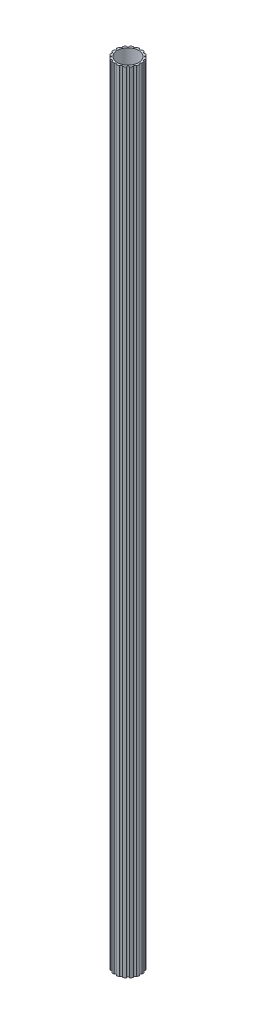
ISO-10303-21;
HEADER;
FILE_DESCRIPTION(('STEP AP214'),'2;1');
FILE_NAME('part.step','',(''),(''),'','','');
FILE_SCHEMA(('AUTOMOTIVE_DESIGN { 1 0 10303 214 1 1 1 1 }'));
ENDSEC;
DATA;
#1=APPLICATION_CONTEXT('core data for automotive mechanical design processes');
#2=APPLICATION_PROTOCOL_DEFINITION('international standard','automotive_design',2000,#1);
#3=PRODUCT_CONTEXT('',#1,'mechanical');
#4=PRODUCT('Part','Part','',(#3));
#5=PRODUCT_RELATED_PRODUCT_CATEGORY('part','',(#4));
#6=PRODUCT_DEFINITION_FORMATION('','',#4);
#7=PRODUCT_DEFINITION_CONTEXT('part definition',#1,'design');
#8=PRODUCT_DEFINITION('design','',#6,#7);
#9=PRODUCT_DEFINITION_SHAPE('','',#8);
#10=(LENGTH_UNIT() NAMED_UNIT(*) SI_UNIT(.MILLI.,.METRE.));
#11=(NAMED_UNIT(*) PLANE_ANGLE_UNIT() SI_UNIT($,.RADIAN.));
#12=(NAMED_UNIT(*) SI_UNIT($,.STERADIAN.) SOLID_ANGLE_UNIT());
#13=UNCERTAINTY_MEASURE_WITH_UNIT(LENGTH_MEASURE(1.E-05),#10,'distance_accuracy_value','');
#14=(GEOMETRIC_REPRESENTATION_CONTEXT(3) GLOBAL_UNCERTAINTY_ASSIGNED_CONTEXT((#13)) GLOBAL_UNIT_ASSIGNED_CONTEXT((#10,
#11,#12)) REPRESENTATION_CONTEXT('',''));
#15=CARTESIAN_POINT('',(0.,0.,0.));
#16=DIRECTION('',(0.,0.,1.));
#17=DIRECTION('',(1.,0.,0.));
#18=AXIS2_PLACEMENT_3D('',#15,#16,#17);
#19=CARTESIAN_POINT('',(0.,1070.,0.));
#20=DIRECTION('',(0.,-1.,0.));
#21=DIRECTION('',(0.,0.,-1.));
#22=AXIS2_PLACEMENT_3D('',#19,#20,#21);
#23=CYLINDRICAL_SURFACE('',#22,17.4625);
#24=DIRECTION('',(0.,-1.,0.));
#25=VECTOR('',#24,1.);
#26=CARTESIAN_POINT('',(11.2426162287253,0.,13.3619791417141));
#27=LINE('',#26,#25);
#28=CARTESIAN_POINT('',(11.2426162287253,1070.,13.3619791417141));
#29=VERTEX_POINT('',#28);
#30=CARTESIAN_POINT('',(11.2426162287253,0.,13.3619791417141));
#31=VERTEX_POINT('',#30);
#32=EDGE_CURVE('E62',#29,#31,#27,.T.);
#33=ORIENTED_EDGE('',*,*,#32,.F.);
#34=CARTESIAN_POINT('',(0.,1070.,0.));
#35=DIRECTION('',(0.,1.,0.));
#36=DIRECTION('',(0.,0.,1.));
#37=AXIS2_PLACEMENT_3D('',#34,#35,#36);
#38=CIRCLE('',#37,17.4625);
#39=CARTESIAN_POINT('',(8.04249607570028,1070.,15.5002310667404));
#40=VERTEX_POINT('',#39);
#41=EDGE_CURVE('E304',#40,#29,#38,.T.);
#42=ORIENTED_EDGE('',*,*,#41,.F.);
#43=DIRECTION('',(0.,-1.,0.));
#44=VECTOR('',#43,1.);
#45=CARTESIAN_POINT('',(8.04249607570028,0.,15.5002310667404));
#46=LINE('',#45,#44);
#47=CARTESIAN_POINT('',(8.04249607570028,0.,15.5002310667404));
#48=VERTEX_POINT('',#47);
#49=EDGE_CURVE('E402',#48,#40,#46,.F.);
#50=ORIENTED_EDGE('',*,*,#49,.F.);
#51=CARTESIAN_POINT('',(0.,0.,0.));
#52=DIRECTION('',(0.,1.,0.));
#53=DIRECTION('',(0.,0.,1.));
#54=AXIS2_PLACEMENT_3D('',#51,#52,#53);
#55=CIRCLE('',#54,17.4625);
#56=EDGE_CURVE('E508',#48,#31,#55,.T.);
#57=ORIENTED_EDGE('',*,*,#56,.T.);
#58=EDGE_LOOP('',(#33,#42,#50,#57));
#59=FACE_BOUND('',#58,.T.);
#60=ADVANCED_FACE('F41',(#59),#23,.T.);
#61=DIRECTION('',(0.,-1.,0.));
#62=VECTOR('',#61,1.);
#63=CARTESIAN_POINT('',(13.3619791417141,0.,11.2426162287253));
#64=LINE('',#63,#62);
#65=CARTESIAN_POINT('',(13.3619791417141,0.,11.2426162287253));
#66=VERTEX_POINT('',#65);
#67=CARTESIAN_POINT('',(13.3619791417141,1070.,11.2426162287253));
#68=VERTEX_POINT('',#67);
#69=EDGE_CURVE('E395',#66,#68,#64,.F.);
#70=ORIENTED_EDGE('',*,*,#69,.F.);
#71=CARTESIAN_POINT('',(15.5002310667404,0.,8.04249607570027));
#72=VERTEX_POINT('',#71);
#73=EDGE_CURVE('E504',#66,#72,#55,.T.);
#74=ORIENTED_EDGE('',*,*,#73,.T.);
#75=DIRECTION('',(0.,-1.,0.));
#76=VECTOR('',#75,1.);
#77=CARTESIAN_POINT('',(15.5002310667404,0.,8.04249607570028));
#78=LINE('',#77,#76);
#79=CARTESIAN_POINT('',(15.5002310667404,1070.,8.04249607570028));
#80=VERTEX_POINT('',#79);
#81=EDGE_CURVE('E54',#80,#72,#78,.T.);
#82=ORIENTED_EDGE('',*,*,#81,.F.);
#83=EDGE_CURVE('E299',#68,#80,#38,.T.);
#84=ORIENTED_EDGE('',*,*,#83,.F.);
#85=EDGE_LOOP('',(#70,#74,#82,#84));
#86=FACE_BOUND('',#85,.T.);
#87=ADVANCED_FACE('F477',(#86),#23,.T.);
#88=DIRECTION('',(0.,-1.,0.));
#89=VECTOR('',#88,1.);
#90=CARTESIAN_POINT('',(5.2734149844567,0.,16.6472220100444));
#91=LINE('',#90,#89);
#92=CARTESIAN_POINT('',(5.2734149844567,1070.,16.6472220100444));
#93=VERTEX_POINT('',#92);
#94=CARTESIAN_POINT('',(5.27341498445671,0.,16.6472220100444));
#95=VERTEX_POINT('',#94);
#96=EDGE_CURVE('E398',#93,#95,#91,.T.);
#97=ORIENTED_EDGE('',*,*,#96,.F.);
#98=CARTESIAN_POINT('',(1.4986158875696,1070.,17.3980762347888));
#99=VERTEX_POINT('',#98);
#100=EDGE_CURVE('E306',#99,#93,#38,.T.);
#101=ORIENTED_EDGE('',*,*,#100,.F.);
#102=DIRECTION('',(0.,-1.,0.));
#103=VECTOR('',#102,1.);
#104=CARTESIAN_POINT('',(1.4986158875696,0.,17.3980762347888));
#105=LINE('',#104,#103);
#106=CARTESIAN_POINT('',(1.4986158875696,0.,17.3980762347888));
#107=VERTEX_POINT('',#106);
#108=EDGE_CURVE('E408',#107,#99,#105,.F.);
#109=ORIENTED_EDGE('',*,*,#108,.F.);
#110=EDGE_CURVE('E509',#107,#95,#55,.T.);
#111=ORIENTED_EDGE('',*,*,#110,.T.);
#112=EDGE_LOOP('',(#97,#101,#109,#111));
#113=FACE_BOUND('',#112,.T.);
#114=ADVANCED_FACE('F486',(#113),#23,.T.);
#115=DIRECTION('',(0.,-1.,0.));
#116=VECTOR('',#115,1.);
#117=CARTESIAN_POINT('',(-1.4986158875696,0.,17.3980762347888));
#118=LINE('',#117,#116);
#119=CARTESIAN_POINT('',(-1.4986158875696,1070.,17.3980762347888));
#120=VERTEX_POINT('',#119);
#121=CARTESIAN_POINT('',(-1.49861588756959,0.,17.3980762347888));
#122=VERTEX_POINT('',#121);
#123=EDGE_CURVE('E404',#120,#122,#118,.T.);
#124=ORIENTED_EDGE('',*,*,#123,.F.);
#125=CARTESIAN_POINT('',(-5.2734149844567,1070.,16.6472220100444));
#126=VERTEX_POINT('',#125);
#127=EDGE_CURVE('E315',#126,#120,#38,.T.);
#128=ORIENTED_EDGE('',*,*,#127,.F.);
#129=DIRECTION('',(0.,-1.,0.));
#130=VECTOR('',#129,1.);
#131=CARTESIAN_POINT('',(-5.2734149844567,0.,16.6472220100444));
#132=LINE('',#131,#130);
#133=CARTESIAN_POINT('',(-5.2734149844567,0.,16.6472220100444));
#134=VERTEX_POINT('',#133);
#135=EDGE_CURVE('E417',#134,#126,#132,.F.);
#136=ORIENTED_EDGE('',*,*,#135,.F.);
#137=EDGE_CURVE('E511',#134,#122,#55,.T.);
#138=ORIENTED_EDGE('',*,*,#137,.T.);
#139=EDGE_LOOP('',(#124,#128,#136,#138));
#140=FACE_BOUND('',#139,.T.);
#141=ADVANCED_FACE('F554',(#140),#23,.T.);
#142=DIRECTION('',(0.,-1.,0.));
#143=VECTOR('',#142,1.);
#144=CARTESIAN_POINT('',(-8.04249607570028,0.,15.5002310667404));
#145=LINE('',#144,#143);
#146=CARTESIAN_POINT('',(-8.04249607570028,1070.,15.5002310667404));
#147=VERTEX_POINT('',#146);
#148=CARTESIAN_POINT('',(-8.04249607570027,0.,15.5002310667404));
#149=VERTEX_POINT('',#148);
#150=EDGE_CURVE('E415',#147,#149,#145,.T.);
#151=ORIENTED_EDGE('',*,*,#150,.F.);
#152=CARTESIAN_POINT('',(-11.2426162287253,1070.,13.3619791417141));
#153=VERTEX_POINT('',#152);
#154=EDGE_CURVE('E316',#153,#147,#38,.T.);
#155=ORIENTED_EDGE('',*,*,#154,.F.);
#156=DIRECTION('',(0.,-1.,0.));
#157=VECTOR('',#156,1.);
#158=CARTESIAN_POINT('',(-11.2426162287253,0.,13.3619791417141));
#159=LINE('',#158,#157);
#160=CARTESIAN_POINT('',(-11.2426162287253,0.,13.3619791417141));
#161=VERTEX_POINT('',#160);
#162=EDGE_CURVE('E422',#161,#153,#159,.F.);
#163=ORIENTED_EDGE('',*,*,#162,.F.);
#164=EDGE_CURVE('E518',#161,#149,#55,.T.);
#165=ORIENTED_EDGE('',*,*,#164,.T.);
#166=EDGE_LOOP('',(#151,#155,#163,#165));
#167=FACE_BOUND('',#166,.T.);
#168=ADVANCED_FACE('F561',(#167),#23,.T.);
#169=DIRECTION('',(0.,-1.,0.));
#170=VECTOR('',#169,1.);
#171=CARTESIAN_POINT('',(-13.3619791417141,0.,11.2426162287253));
#172=LINE('',#171,#170);
#173=CARTESIAN_POINT('',(-13.3619791417141,1070.,11.2426162287253));
#174=VERTEX_POINT('',#173);
#175=CARTESIAN_POINT('',(-13.3619791417141,0.,11.2426162287253));
#176=VERTEX_POINT('',#175);
#177=EDGE_CURVE('E419',#174,#176,#172,.T.);
#178=ORIENTED_EDGE('',*,*,#177,.F.);
#179=CARTESIAN_POINT('',(-15.5002310667404,1070.,8.04249607570028));
#180=VERTEX_POINT('',#179);
#181=EDGE_CURVE('E319',#180,#174,#38,.T.);
#182=ORIENTED_EDGE('',*,*,#181,.F.);
#183=DIRECTION('',(0.,-1.,0.));
#184=VECTOR('',#183,1.);
#185=CARTESIAN_POINT('',(-15.5002310667404,0.,8.04249607570028));
#186=LINE('',#185,#184);
#187=CARTESIAN_POINT('',(-15.5002310667404,0.,8.04249607570028));
#188=VERTEX_POINT('',#187);
#189=EDGE_CURVE('E433',#188,#180,#186,.F.);
#190=ORIENTED_EDGE('',*,*,#189,.F.);
#191=EDGE_CURVE('E522',#188,#176,#55,.T.);
#192=ORIENTED_EDGE('',*,*,#191,.T.);
#193=EDGE_LOOP('',(#178,#182,#190,#192));
#194=FACE_BOUND('',#193,.T.);
#195=ADVANCED_FACE('F546',(#194),#23,.T.);
#196=DIRECTION('',(0.,-1.,0.));
#197=VECTOR('',#196,1.);
#198=CARTESIAN_POINT('',(-16.6472220100444,0.,5.2734149844567));
#199=LINE('',#198,#197);
#200=CARTESIAN_POINT('',(-16.6472220100444,1070.,5.2734149844567));
#201=VERTEX_POINT('',#200);
#202=CARTESIAN_POINT('',(-16.6472220100444,0.,5.27341498445671));
#203=VERTEX_POINT('',#202);
#204=EDGE_CURVE('E428',#201,#203,#199,.T.);
#205=ORIENTED_EDGE('',*,*,#204,.F.);
#206=CARTESIAN_POINT('',(-17.3980762347888,1070.,1.4986158875696));
#207=VERTEX_POINT('',#206);
#208=EDGE_CURVE('E322',#207,#201,#38,.T.);
#209=ORIENTED_EDGE('',*,*,#208,.F.);
#210=DIRECTION('',(0.,-1.,0.));
#211=VECTOR('',#210,1.);
#212=CARTESIAN_POINT('',(-17.3980762347888,0.,1.4986158875696));
#213=LINE('',#212,#211);
#214=CARTESIAN_POINT('',(-17.3980762347888,0.,1.4986158875696));
#215=VERTEX_POINT('',#214);
#216=EDGE_CURVE('E442',#215,#207,#213,.F.);
#217=ORIENTED_EDGE('',*,*,#216,.F.);
#218=EDGE_CURVE('E278',#215,#203,#55,.T.);
#219=ORIENTED_EDGE('',*,*,#218,.T.);
#220=EDGE_LOOP('',(#205,#209,#217,#219));
#221=FACE_BOUND('',#220,.T.);
#222=ADVANCED_FACE('F539',(#221),#23,.T.);
#223=DIRECTION('',(0.,-1.,0.));
#224=VECTOR('',#223,1.);
#225=CARTESIAN_POINT('',(-17.3980762347888,0.,-1.4986158875696));
#226=LINE('',#225,#224);
#227=CARTESIAN_POINT('',(-17.3980762347888,1070.,-1.4986158875696));
#228=VERTEX_POINT('',#227);
#229=CARTESIAN_POINT('',(-17.3980762347888,0.,-1.49861588756959));
#230=VERTEX_POINT('',#229);
#231=EDGE_CURVE('E436',#228,#230,#226,.T.);
#232=ORIENTED_EDGE('',*,*,#231,.F.);
#233=CARTESIAN_POINT('',(-16.6472220100444,1070.,-5.2734149844567));
#234=VERTEX_POINT('',#233);
#235=EDGE_CURVE('E327',#234,#228,#38,.T.);
#236=ORIENTED_EDGE('',*,*,#235,.F.);
#237=DIRECTION('',(0.,-1.,0.));
#238=VECTOR('',#237,1.);
#239=CARTESIAN_POINT('',(-16.6472220100444,0.,-5.2734149844567));
#240=LINE('',#239,#238);
#241=CARTESIAN_POINT('',(-16.6472220100444,0.,-5.2734149844567));
#242=VERTEX_POINT('',#241);
#243=EDGE_CURVE('E450',#242,#234,#240,.F.);
#244=ORIENTED_EDGE('',*,*,#243,.F.);
#245=EDGE_CURVE('E277',#242,#230,#55,.T.);
#246=ORIENTED_EDGE('',*,*,#245,.T.);
#247=EDGE_LOOP('',(#232,#236,#244,#246));
#248=FACE_BOUND('',#247,.T.);
#249=ADVANCED_FACE('F572',(#248),#23,.T.);
#250=DIRECTION('',(0.,-1.,0.));
#251=VECTOR('',#250,1.);
#252=CARTESIAN_POINT('',(-15.5002310667404,0.,-8.04249607570028));
#253=LINE('',#252,#251);
#254=CARTESIAN_POINT('',(-15.5002310667404,1070.,-8.04249607570028));
#255=VERTEX_POINT('',#254);
#256=CARTESIAN_POINT('',(-15.5002310667404,0.,-8.04249607570027));
#257=VERTEX_POINT('',#256);
#258=EDGE_CURVE('E441',#255,#257,#253,.T.);
#259=ORIENTED_EDGE('',*,*,#258,.F.);
#260=CARTESIAN_POINT('',(-13.3619791417141,1070.,-11.2426162287253));
#261=VERTEX_POINT('',#260);
#262=EDGE_CURVE('E270',#261,#255,#38,.T.);
#263=ORIENTED_EDGE('',*,*,#262,.F.);
#264=DIRECTION('',(0.,-1.,0.));
#265=VECTOR('',#264,1.);
#266=CARTESIAN_POINT('',(-13.3619791417141,0.,-11.2426162287253));
#267=LINE('',#266,#265);
#268=CARTESIAN_POINT('',(-13.3619791417141,0.,-11.2426162287253));
#269=VERTEX_POINT('',#268);
#270=EDGE_CURVE('E253',#269,#261,#267,.F.);
#271=ORIENTED_EDGE('',*,*,#270,.F.);
#272=EDGE_CURVE('E264',#269,#257,#55,.T.);
#273=ORIENTED_EDGE('',*,*,#272,.T.);
#274=EDGE_LOOP('',(#259,#263,#271,#273));
#275=FACE_BOUND('',#274,.T.);
#276=ADVANCED_FACE('F262',(#275),#23,.T.);
#277=DIRECTION('',(0.,-1.,0.));
#278=VECTOR('',#277,1.);
#279=CARTESIAN_POINT('',(-11.2426162287253,0.,-13.3619791417141));
#280=LINE('',#279,#278);
#281=CARTESIAN_POINT('',(-11.2426162287253,1070.,-13.3619791417141));
#282=VERTEX_POINT('',#281);
#283=CARTESIAN_POINT('',(-11.2426162287253,0.,-13.3619791417141));
#284=VERTEX_POINT('',#283);
#285=EDGE_CURVE('E255',#282,#284,#280,.T.);
#286=ORIENTED_EDGE('',*,*,#285,.F.);
#287=CARTESIAN_POINT('',(-8.04249607570029,1070.,-15.5002310667404));
#288=VERTEX_POINT('',#287);
#289=EDGE_CURVE('E331',#288,#282,#38,.T.);
#290=ORIENTED_EDGE('',*,*,#289,.F.);
#291=DIRECTION('',(0.,-1.,0.));
#292=VECTOR('',#291,1.);
#293=CARTESIAN_POINT('',(-8.04249607570029,0.,-15.5002310667404));
#294=LINE('',#293,#292);
#295=CARTESIAN_POINT('',(-8.04249607570029,0.,-15.5002310667404));
#296=VERTEX_POINT('',#295);
#297=EDGE_CURVE('E850',#296,#288,#294,.F.);
#298=ORIENTED_EDGE('',*,*,#297,.F.);
#299=EDGE_CURVE('E274',#296,#284,#55,.T.);
#300=ORIENTED_EDGE('',*,*,#299,.T.);
#301=EDGE_LOOP('',(#286,#290,#298,#300));
#302=FACE_BOUND('',#301,.T.);
#303=ADVANCED_FACE('F583',(#302),#23,.T.);
#304=DIRECTION('',(0.,-1.,0.));
#305=VECTOR('',#304,1.);
#306=CARTESIAN_POINT('',(-5.27341498445671,0.,-16.6472220100444));
#307=LINE('',#306,#305);
#308=CARTESIAN_POINT('',(-5.27341498445671,1070.,-16.6472220100444));
#309=VERTEX_POINT('',#308);
#310=CARTESIAN_POINT('',(-5.27341498445672,0.,-16.6472220100444));
#311=VERTEX_POINT('',#310);
#312=EDGE_CURVE('E837',#309,#311,#307,.T.);
#313=ORIENTED_EDGE('',*,*,#312,.F.);
#314=CARTESIAN_POINT('',(-1.4986158875696,1070.,-17.3980762347888));
#315=VERTEX_POINT('',#314);
#316=EDGE_CURVE('E336',#315,#309,#38,.T.);
#317=ORIENTED_EDGE('',*,*,#316,.F.);
#318=DIRECTION('',(0.,-1.,0.));
#319=VECTOR('',#318,1.);
#320=CARTESIAN_POINT('',(-1.4986158875696,0.,-17.3980762347888));
#321=LINE('',#320,#319);
#322=CARTESIAN_POINT('',(-1.4986158875696,0.,-17.3980762347888));
#323=VERTEX_POINT('',#322);
#324=EDGE_CURVE('E842',#323,#315,#321,.F.);
#325=ORIENTED_EDGE('',*,*,#324,.F.);
#326=EDGE_CURVE('E279',#323,#311,#55,.T.);
#327=ORIENTED_EDGE('',*,*,#326,.T.);
#328=EDGE_LOOP('',(#313,#317,#325,#327));
#329=FACE_BOUND('',#328,.T.);
#330=ADVANCED_FACE('F760',(#329),#23,.T.);
#331=DIRECTION('',(0.,-1.,0.));
#332=VECTOR('',#331,1.);
#333=CARTESIAN_POINT('',(1.4986158875696,0.,-17.3980762347888));
#334=LINE('',#333,#332);
#335=CARTESIAN_POINT('',(1.4986158875696,1070.,-17.3980762347888));
#336=VERTEX_POINT('',#335);
#337=CARTESIAN_POINT('',(1.49861588756959,0.,-17.3980762347888));
#338=VERTEX_POINT('',#337);
#339=EDGE_CURVE('E372',#336,#338,#334,.T.);
#340=ORIENTED_EDGE('',*,*,#339,.F.);
#341=CARTESIAN_POINT('',(5.2734149844567,1070.,-16.6472220100444));
#342=VERTEX_POINT('',#341);
#343=EDGE_CURVE('E339',#342,#336,#38,.T.);
#344=ORIENTED_EDGE('',*,*,#343,.F.);
#345=DIRECTION('',(0.,-1.,0.));
#346=VECTOR('',#345,1.);
#347=CARTESIAN_POINT('',(5.27341498445671,0.,-16.6472220100444));
#348=LINE('',#347,#346);
#349=CARTESIAN_POINT('',(5.2734149844567,0.,-16.6472220100444));
#350=VERTEX_POINT('',#349);
#351=EDGE_CURVE('E364',#350,#342,#348,.F.);
#352=ORIENTED_EDGE('',*,*,#351,.F.);
#353=EDGE_CURVE('E831',#350,#338,#55,.T.);
#354=ORIENTED_EDGE('',*,*,#353,.T.);
#355=EDGE_LOOP('',(#340,#344,#352,#354));
#356=FACE_BOUND('',#355,.T.);
#357=ADVANCED_FACE('F766',(#356),#23,.T.);
#358=DIRECTION('',(0.,-1.,0.));
#359=VECTOR('',#358,1.);
#360=CARTESIAN_POINT('',(8.04249607570029,0.,-15.5002310667404));
#361=LINE('',#360,#359);
#362=CARTESIAN_POINT('',(8.04249607570029,1070.,-15.5002310667404));
#363=VERTEX_POINT('',#362);
#364=CARTESIAN_POINT('',(8.04249607570027,0.,-15.5002310667404));
#365=VERTEX_POINT('',#364);
#366=EDGE_CURVE('E359',#363,#365,#361,.T.);
#367=ORIENTED_EDGE('',*,*,#366,.F.);
#368=CARTESIAN_POINT('',(11.2426162287253,1070.,-13.3619791417141));
#369=VERTEX_POINT('',#368);
#370=EDGE_CURVE('E298',#369,#363,#38,.T.);
#371=ORIENTED_EDGE('',*,*,#370,.F.);
#372=DIRECTION('',(0.,-1.,0.));
#373=VECTOR('',#372,1.);
#374=CARTESIAN_POINT('',(11.2426162287253,0.,-13.3619791417141));
#375=LINE('',#374,#373);
#376=CARTESIAN_POINT('',(11.2426162287253,0.,-13.3619791417141));
#377=VERTEX_POINT('',#376);
#378=EDGE_CURVE('E360',#377,#369,#375,.F.);
#379=ORIENTED_EDGE('',*,*,#378,.F.);
#380=EDGE_CURVE('E357',#377,#365,#55,.T.);
#381=ORIENTED_EDGE('',*,*,#380,.T.);
#382=EDGE_LOOP('',(#367,#371,#379,#381));
#383=FACE_BOUND('',#382,.T.);
#384=ADVANCED_FACE('F354',(#383),#23,.T.);
#385=DIRECTION('',(0.,-1.,0.));
#386=VECTOR('',#385,1.);
#387=CARTESIAN_POINT('',(13.3619791417141,0.,-11.2426162287253));
#388=LINE('',#387,#386);
#389=CARTESIAN_POINT('',(13.3619791417141,1070.,-11.2426162287253));
#390=VERTEX_POINT('',#389);
#391=CARTESIAN_POINT('',(13.3619791417141,0.,-11.2426162287253));
#392=VERTEX_POINT('',#391);
#393=EDGE_CURVE('E374',#390,#392,#388,.T.);
#394=ORIENTED_EDGE('',*,*,#393,.F.);
#395=CARTESIAN_POINT('',(15.5002310667404,1070.,-8.04249607570029));
#396=VERTEX_POINT('',#395);
#397=EDGE_CURVE('E294',#396,#390,#38,.T.);
#398=ORIENTED_EDGE('',*,*,#397,.F.);
#399=DIRECTION('',(0.,-1.,0.));
#400=VECTOR('',#399,1.);
#401=CARTESIAN_POINT('',(15.5002310667404,0.,-8.04249607570029));
#402=LINE('',#401,#400);
#403=CARTESIAN_POINT('',(15.5002310667404,0.,-8.04249607570029));
#404=VERTEX_POINT('',#403);
#405=EDGE_CURVE('E384',#404,#396,#402,.F.);
#406=ORIENTED_EDGE('',*,*,#405,.F.);
#407=EDGE_CURVE('E284',#404,#392,#55,.T.);
#408=ORIENTED_EDGE('',*,*,#407,.T.);
#409=EDGE_LOOP('',(#394,#398,#406,#408));
#410=FACE_BOUND('',#409,.T.);
#411=ADVANCED_FACE('F497',(#410),#23,.T.);
#412=DIRECTION('',(0.,-1.,0.));
#413=VECTOR('',#412,1.);
#414=CARTESIAN_POINT('',(16.6472220100444,0.,-5.27341498445671));
#415=LINE('',#414,#413);
#416=CARTESIAN_POINT('',(16.6472220100444,1070.,-5.27341498445671));
#417=VERTEX_POINT('',#416);
#418=CARTESIAN_POINT('',(16.6472220100444,0.,-5.27341498445672));
#419=VERTEX_POINT('',#418);
#420=EDGE_CURVE('E381',#417,#419,#415,.T.);
#421=ORIENTED_EDGE('',*,*,#420,.F.);
#422=CARTESIAN_POINT('',(17.3980762347888,1070.,-1.4986158875696));
#423=VERTEX_POINT('',#422);
#424=EDGE_CURVE('E290',#423,#417,#38,.T.);
#425=ORIENTED_EDGE('',*,*,#424,.F.);
#426=DIRECTION('',(0.,-1.,0.));
#427=VECTOR('',#426,1.);
#428=CARTESIAN_POINT('',(17.3980762347888,0.,-1.4986158875696));
#429=LINE('',#428,#427);
#430=CARTESIAN_POINT('',(17.3980762347888,0.,-1.4986158875696));
#431=VERTEX_POINT('',#430);
#432=EDGE_CURVE('E48',#431,#423,#429,.F.);
#433=ORIENTED_EDGE('',*,*,#432,.F.);
#434=EDGE_CURVE('E281',#431,#419,#55,.T.);
#435=ORIENTED_EDGE('',*,*,#434,.T.);
#436=EDGE_LOOP('',(#421,#425,#433,#435));
#437=FACE_BOUND('',#436,.T.);
#438=ADVANCED_FACE('F487',(#437),#23,.T.);
#439=DIRECTION('',(0.,-1.,0.));
#440=VECTOR('',#439,1.);
#441=CARTESIAN_POINT('',(16.6472220100444,0.,5.2734149844567));
#442=LINE('',#441,#440);
#443=CARTESIAN_POINT('',(16.6472220100444,0.,5.2734149844567));
#444=VERTEX_POINT('',#443);
#445=CARTESIAN_POINT('',(16.6472220100444,1070.,5.2734149844567));
#446=VERTEX_POINT('',#445);
#447=EDGE_CURVE('E451',#444,#446,#442,.F.);
#448=ORIENTED_EDGE('',*,*,#447,.F.);
#449=CARTESIAN_POINT('',(17.3980762347888,0.,1.49861588756959));
#450=VERTEX_POINT('',#449);
#451=EDGE_CURVE('E288',#444,#450,#55,.T.);
#452=ORIENTED_EDGE('',*,*,#451,.T.);
#453=DIRECTION('',(0.,-1.,0.));
#454=VECTOR('',#453,1.);
#455=CARTESIAN_POINT('',(17.3980762347888,0.,1.4986158875696));
#456=LINE('',#455,#454);
#457=CARTESIAN_POINT('',(17.3980762347888,1070.,1.4986158875696));
#458=VERTEX_POINT('',#457);
#459=EDGE_CURVE('E11',#458,#450,#456,.T.);
#460=ORIENTED_EDGE('',*,*,#459,.F.);
#461=EDGE_CURVE('E283',#446,#458,#38,.T.);
#462=ORIENTED_EDGE('',*,*,#461,.F.);
#463=EDGE_LOOP('',(#448,#452,#460,#462));
#464=FACE_BOUND('',#463,.T.);
#465=ADVANCED_FACE('F485',(#464),#23,.T.);
#466=CARTESIAN_POINT('',(0.,1070.,0.));
#467=DIRECTION('',(0.,1.,0.));
#468=DIRECTION('',(0.,0.,1.));
#469=AXIS2_PLACEMENT_3D('',#466,#467,#468);
#470=PLANE('',#469);
#471=CARTESIAN_POINT('',(0.,1070.,0.));
#472=DIRECTION('',(0.,1.,0.));
#473=DIRECTION('',(0.,0.,1.));
#474=AXIS2_PLACEMENT_3D('',#471,#472,#473);
#475=CIRCLE('',#474,14.4145);
#476=CARTESIAN_POINT('',(0.,1070.,14.4145));
#477=VERTEX_POINT('',#476);
#478=EDGE_CURVE('E465',#477,#477,#475,.T.);
#479=ORIENTED_EDGE('',*,*,#478,.F.);
#480=EDGE_LOOP('',(#479));
#481=FACE_BOUND('',#480,.T.);
#482=ORIENTED_EDGE('',*,*,#41,.T.);
#483=CARTESIAN_POINT('',(12.3478521664701,1070.,12.3478521664701));
#484=DIRECTION('',(0.,1.,0.));
#485=DIRECTION('',(-0.707106781186548,0.,0.707106781186548));
#486=AXIS2_PLACEMENT_3D('',#483,#484,#485);
#487=CIRCLE('',#486,1.5);
#488=EDGE_CURVE('E393',#68,#29,#487,.T.);
#489=ORIENTED_EDGE('',*,*,#488,.F.);
#490=ORIENTED_EDGE('',*,*,#83,.T.);
#491=CARTESIAN_POINT('',(16.1332463364783,1070.,6.68260943767538));
#492=DIRECTION('',(0.,1.,0.));
#493=DIRECTION('',(-0.38268343236509,0.,0.923879532511287));
#494=AXIS2_PLACEMENT_3D('',#491,#492,#493);
#495=CIRCLE('',#494,1.5);
#496=EDGE_CURVE('E452',#446,#80,#495,.T.);
#497=ORIENTED_EDGE('',*,*,#496,.F.);
#498=ORIENTED_EDGE('',*,*,#461,.T.);
#499=CARTESIAN_POINT('',(17.4625,1070.,0.));
#500=DIRECTION('',(0.,1.,0.));
#501=DIRECTION('',(0.,0.,1.));
#502=AXIS2_PLACEMENT_3D('',#499,#500,#501);
#503=CIRCLE('',#502,1.5);
#504=EDGE_CURVE('E460',#423,#458,#503,.T.);
#505=ORIENTED_EDGE('',*,*,#504,.F.);
#506=ORIENTED_EDGE('',*,*,#424,.T.);
#507=CARTESIAN_POINT('',(16.1332463364783,1070.,-6.68260943767539));
#508=DIRECTION('',(0.,1.,0.));
#509=DIRECTION('',(0.38268343236509,0.,0.923879532511287));
#510=AXIS2_PLACEMENT_3D('',#507,#508,#509);
#511=CIRCLE('',#510,1.5);
#512=EDGE_CURVE('E378',#396,#417,#511,.T.);
#513=ORIENTED_EDGE('',*,*,#512,.F.);
#514=ORIENTED_EDGE('',*,*,#397,.T.);
#515=CARTESIAN_POINT('',(12.3478521664701,1070.,-12.3478521664701));
#516=DIRECTION('',(0.,1.,0.));
#517=DIRECTION('',(0.707106781186548,0.,0.707106781186547));
#518=AXIS2_PLACEMENT_3D('',#515,#516,#517);
#519=CIRCLE('',#518,1.5);
#520=EDGE_CURVE('E351',#369,#390,#519,.T.);
#521=ORIENTED_EDGE('',*,*,#520,.F.);
#522=ORIENTED_EDGE('',*,*,#370,.T.);
#523=CARTESIAN_POINT('',(6.68260943767539,1070.,-16.1332463364783));
#524=DIRECTION('',(0.,1.,0.));
#525=DIRECTION('',(0.923879532511287,0.,0.38268343236509));
#526=AXIS2_PLACEMENT_3D('',#523,#524,#525);
#527=CIRCLE('',#526,1.5);
#528=EDGE_CURVE('E348',#342,#363,#527,.T.);
#529=ORIENTED_EDGE('',*,*,#528,.F.);
#530=ORIENTED_EDGE('',*,*,#343,.T.);
#531=CARTESIAN_POINT('',(0.,1070.,-17.4625));
#532=DIRECTION('',(0.,1.,0.));
#533=DIRECTION('',(1.,0.,0.));
#534=AXIS2_PLACEMENT_3D('',#531,#532,#533);
#535=CIRCLE('',#534,1.5);
#536=EDGE_CURVE('E369',#315,#336,#535,.T.);
#537=ORIENTED_EDGE('',*,*,#536,.F.);
#538=ORIENTED_EDGE('',*,*,#316,.T.);
#539=CARTESIAN_POINT('',(-6.68260943767539,1070.,-16.1332463364783));
#540=DIRECTION('',(0.,1.,0.));
#541=DIRECTION('',(0.923879532511287,0.,-0.38268343236509));
#542=AXIS2_PLACEMENT_3D('',#539,#540,#541);
#543=CIRCLE('',#542,1.5);
#544=EDGE_CURVE('E848',#288,#309,#543,.T.);
#545=ORIENTED_EDGE('',*,*,#544,.F.);
#546=ORIENTED_EDGE('',*,*,#289,.T.);
#547=CARTESIAN_POINT('',(-12.3478521664701,1070.,-12.3478521664701));
#548=DIRECTION('',(0.,1.,0.));
#549=DIRECTION('',(0.707106781186547,0.,-0.707106781186548));
#550=AXIS2_PLACEMENT_3D('',#547,#548,#549);
#551=CIRCLE('',#550,1.5);
#552=EDGE_CURVE('E268',#261,#282,#551,.T.);
#553=ORIENTED_EDGE('',*,*,#552,.F.);
#554=ORIENTED_EDGE('',*,*,#262,.T.);
#555=CARTESIAN_POINT('',(-16.1332463364783,1070.,-6.68260943767538));
#556=DIRECTION('',(0.,1.,0.));
#557=DIRECTION('',(0.38268343236509,0.,-0.923879532511287));
#558=AXIS2_PLACEMENT_3D('',#555,#556,#557);
#559=CIRCLE('',#558,1.5);
#560=EDGE_CURVE('E438',#234,#255,#559,.T.);
#561=ORIENTED_EDGE('',*,*,#560,.F.);
#562=ORIENTED_EDGE('',*,*,#235,.T.);
#563=CARTESIAN_POINT('',(-17.4625,1070.,0.));
#564=DIRECTION('',(0.,1.,0.));
#565=DIRECTION('',(0.,0.,-1.));
#566=AXIS2_PLACEMENT_3D('',#563,#564,#565);
#567=CIRCLE('',#566,1.5);
#568=EDGE_CURVE('E431',#207,#228,#567,.T.);
#569=ORIENTED_EDGE('',*,*,#568,.F.);
#570=ORIENTED_EDGE('',*,*,#208,.T.);
#571=CARTESIAN_POINT('',(-16.1332463364783,1070.,6.68260943767538));
#572=DIRECTION('',(0.,1.,0.));
#573=DIRECTION('',(-0.38268343236509,0.,-0.923879532511287));
#574=AXIS2_PLACEMENT_3D('',#571,#572,#573);
#575=CIRCLE('',#574,1.5);
#576=EDGE_CURVE('E421',#180,#201,#575,.T.);
#577=ORIENTED_EDGE('',*,*,#576,.F.);
#578=ORIENTED_EDGE('',*,*,#181,.T.);
#579=CARTESIAN_POINT('',(-12.3478521664701,1070.,12.3478521664701));
#580=DIRECTION('',(0.,1.,0.));
#581=DIRECTION('',(-0.707106781186548,0.,-0.707106781186547));
#582=AXIS2_PLACEMENT_3D('',#579,#580,#581);
#583=CIRCLE('',#582,1.5);
#584=EDGE_CURVE('E412',#153,#174,#583,.T.);
#585=ORIENTED_EDGE('',*,*,#584,.F.);
#586=ORIENTED_EDGE('',*,*,#154,.T.);
#587=CARTESIAN_POINT('',(-6.68260943767538,1070.,16.1332463364783));
#588=DIRECTION('',(0.,1.,0.));
#589=DIRECTION('',(-0.923879532511287,0.,-0.38268343236509));
#590=AXIS2_PLACEMENT_3D('',#587,#588,#589);
#591=CIRCLE('',#590,1.5);
#592=EDGE_CURVE('E410',#126,#147,#591,.T.);
#593=ORIENTED_EDGE('',*,*,#592,.F.);
#594=ORIENTED_EDGE('',*,*,#127,.T.);
#595=CARTESIAN_POINT('',(0.,1070.,17.4625));
#596=DIRECTION('',(0.,1.,0.));
#597=DIRECTION('',(-1.,0.,0.));
#598=AXIS2_PLACEMENT_3D('',#595,#596,#597);
#599=CIRCLE('',#598,1.5);
#600=EDGE_CURVE('E399',#99,#120,#599,.T.);
#601=ORIENTED_EDGE('',*,*,#600,.F.);
#602=ORIENTED_EDGE('',*,*,#100,.T.);
#603=CARTESIAN_POINT('',(6.68260943767538,1070.,16.1332463364783));
#604=DIRECTION('',(0.,1.,0.));
#605=DIRECTION('',(-0.923879532511287,0.,0.38268343236509));
#606=AXIS2_PLACEMENT_3D('',#603,#604,#605);
#607=CIRCLE('',#606,1.5);
#608=EDGE_CURVE('E388',#40,#93,#607,.T.);
#609=ORIENTED_EDGE('',*,*,#608,.F.);
#610=EDGE_LOOP('',(#482,#489,#490,#497,#498,#505,#506,#513,#514,#521,#522,#529,#530,#537,#538,
#545,#546,#553,#554,#561,#562,#569,#570,#577,#578,#585,#586,#593,#594,#601,#602,#609));
#611=FACE_BOUND('',#610,.T.);
#612=ADVANCED_FACE('F349',(#481,#611),#470,.T.);
#613=CARTESIAN_POINT('',(0.,0.,0.));
#614=DIRECTION('',(0.,1.,0.));
#615=DIRECTION('',(0.,0.,1.));
#616=AXIS2_PLACEMENT_3D('',#613,#614,#615);
#617=PLANE('',#616);
#618=CARTESIAN_POINT('',(12.3478521664701,0.,12.3478521664701));
#619=DIRECTION('',(0.,1.,0.));
#620=DIRECTION('',(-0.707106781186548,0.,0.707106781186548));
#621=AXIS2_PLACEMENT_3D('',#618,#619,#620);
#622=CIRCLE('',#621,1.5);
#623=EDGE_CURVE('E386',#31,#66,#622,.F.);
#624=ORIENTED_EDGE('',*,*,#623,.F.);
#625=ORIENTED_EDGE('',*,*,#56,.F.);
#626=CARTESIAN_POINT('',(6.68260943767538,0.,16.1332463364783));
#627=DIRECTION('',(0.,1.,0.));
#628=DIRECTION('',(-0.923879532511287,0.,0.38268343236509));
#629=AXIS2_PLACEMENT_3D('',#626,#627,#628);
#630=CIRCLE('',#629,1.5);
#631=EDGE_CURVE('E396',#95,#48,#630,.F.);
#632=ORIENTED_EDGE('',*,*,#631,.F.);
#633=ORIENTED_EDGE('',*,*,#110,.F.);
#634=CARTESIAN_POINT('',(0.,0.,17.4625));
#635=DIRECTION('',(0.,1.,0.));
#636=DIRECTION('',(-1.,0.,0.));
#637=AXIS2_PLACEMENT_3D('',#634,#635,#636);
#638=CIRCLE('',#637,1.5);
#639=EDGE_CURVE('E406',#122,#107,#638,.F.);
#640=ORIENTED_EDGE('',*,*,#639,.F.);
#641=ORIENTED_EDGE('',*,*,#137,.F.);
#642=CARTESIAN_POINT('',(-6.68260943767538,0.,16.1332463364783));
#643=DIRECTION('',(0.,1.,0.));
#644=DIRECTION('',(-0.923879532511287,0.,-0.38268343236509));
#645=AXIS2_PLACEMENT_3D('',#642,#643,#644);
#646=CIRCLE('',#645,1.5);
#647=EDGE_CURVE('E414',#149,#134,#646,.F.);
#648=ORIENTED_EDGE('',*,*,#647,.F.);
#649=ORIENTED_EDGE('',*,*,#164,.F.);
#650=CARTESIAN_POINT('',(-12.3478521664701,0.,12.3478521664701));
#651=DIRECTION('',(0.,1.,0.));
#652=DIRECTION('',(-0.707106781186548,0.,-0.707106781186547));
#653=AXIS2_PLACEMENT_3D('',#650,#651,#652);
#654=CIRCLE('',#653,1.5);
#655=EDGE_CURVE('E425',#176,#161,#654,.F.);
#656=ORIENTED_EDGE('',*,*,#655,.F.);
#657=ORIENTED_EDGE('',*,*,#191,.F.);
#658=CARTESIAN_POINT('',(-16.1332463364783,0.,6.68260943767538));
#659=DIRECTION('',(0.,1.,0.));
#660=DIRECTION('',(-0.38268343236509,0.,-0.923879532511287));
#661=AXIS2_PLACEMENT_3D('',#658,#659,#660);
#662=CIRCLE('',#661,1.5);
#663=EDGE_CURVE('E429',#203,#188,#662,.F.);
#664=ORIENTED_EDGE('',*,*,#663,.F.);
#665=ORIENTED_EDGE('',*,*,#218,.F.);
#666=CARTESIAN_POINT('',(-17.4625,0.,0.));
#667=DIRECTION('',(0.,1.,0.));
#668=DIRECTION('',(0.,0.,-1.));
#669=AXIS2_PLACEMENT_3D('',#666,#667,#668);
#670=CIRCLE('',#669,1.5);
#671=EDGE_CURVE('E437',#230,#215,#670,.F.);
#672=ORIENTED_EDGE('',*,*,#671,.F.);
#673=ORIENTED_EDGE('',*,*,#245,.F.);
#674=CARTESIAN_POINT('',(-16.1332463364783,0.,-6.68260943767538));
#675=DIRECTION('',(0.,1.,0.));
#676=DIRECTION('',(0.38268343236509,0.,-0.923879532511287));
#677=AXIS2_PLACEMENT_3D('',#674,#675,#676);
#678=CIRCLE('',#677,1.5);
#679=EDGE_CURVE('E273',#257,#242,#678,.F.);
#680=ORIENTED_EDGE('',*,*,#679,.F.);
#681=ORIENTED_EDGE('',*,*,#272,.F.);
#682=CARTESIAN_POINT('',(-12.3478521664701,0.,-12.3478521664701));
#683=DIRECTION('',(0.,1.,0.));
#684=DIRECTION('',(0.707106781186547,0.,-0.707106781186548));
#685=AXIS2_PLACEMENT_3D('',#682,#683,#684);
#686=CIRCLE('',#685,1.5);
#687=EDGE_CURVE('E246',#284,#269,#686,.F.);
#688=ORIENTED_EDGE('',*,*,#687,.F.);
#689=ORIENTED_EDGE('',*,*,#299,.F.);
#690=CARTESIAN_POINT('',(-6.68260943767539,0.,-16.1332463364783));
#691=DIRECTION('',(0.,1.,0.));
#692=DIRECTION('',(0.923879532511287,0.,-0.38268343236509));
#693=AXIS2_PLACEMENT_3D('',#690,#691,#692);
#694=CIRCLE('',#693,1.5);
#695=EDGE_CURVE('E843',#311,#296,#694,.F.);
#696=ORIENTED_EDGE('',*,*,#695,.F.);
#697=ORIENTED_EDGE('',*,*,#326,.F.);
#698=CARTESIAN_POINT('',(0.,0.,-17.4625));
#699=DIRECTION('',(0.,1.,0.));
#700=DIRECTION('',(1.,0.,0.));
#701=AXIS2_PLACEMENT_3D('',#698,#699,#700);
#702=CIRCLE('',#701,1.5);
#703=EDGE_CURVE('E844',#338,#323,#702,.F.);
#704=ORIENTED_EDGE('',*,*,#703,.F.);
#705=ORIENTED_EDGE('',*,*,#353,.F.);
#706=CARTESIAN_POINT('',(6.68260943767539,0.,-16.1332463364783));
#707=DIRECTION('',(0.,1.,0.));
#708=DIRECTION('',(0.923879532511287,0.,0.38268343236509));
#709=AXIS2_PLACEMENT_3D('',#706,#707,#708);
#710=CIRCLE('',#709,1.5);
#711=EDGE_CURVE('E361',#365,#350,#710,.F.);
#712=ORIENTED_EDGE('',*,*,#711,.F.);
#713=ORIENTED_EDGE('',*,*,#380,.F.);
#714=CARTESIAN_POINT('',(12.3478521664701,0.,-12.3478521664701));
#715=DIRECTION('',(0.,1.,0.));
#716=DIRECTION('',(0.707106781186548,0.,0.707106781186547));
#717=AXIS2_PLACEMENT_3D('',#714,#715,#716);
#718=CIRCLE('',#717,1.5);
#719=EDGE_CURVE('E380',#392,#377,#718,.F.);
#720=ORIENTED_EDGE('',*,*,#719,.F.);
#721=ORIENTED_EDGE('',*,*,#407,.F.);
#722=CARTESIAN_POINT('',(16.1332463364783,0.,-6.68260943767539));
#723=DIRECTION('',(0.,1.,0.));
#724=DIRECTION('',(0.38268343236509,0.,0.923879532511287));
#725=AXIS2_PLACEMENT_3D('',#722,#723,#724);
#726=CIRCLE('',#725,1.5);
#727=EDGE_CURVE('E382',#419,#404,#726,.F.);
#728=ORIENTED_EDGE('',*,*,#727,.F.);
#729=ORIENTED_EDGE('',*,*,#434,.F.);
#730=CARTESIAN_POINT('',(17.4625,0.,0.));
#731=DIRECTION('',(0.,1.,0.));
#732=DIRECTION('',(0.,0.,1.));
#733=AXIS2_PLACEMENT_3D('',#730,#731,#732);
#734=CIRCLE('',#733,1.5);
#735=EDGE_CURVE('E459',#450,#431,#734,.F.);
#736=ORIENTED_EDGE('',*,*,#735,.F.);
#737=ORIENTED_EDGE('',*,*,#451,.F.);
#738=CARTESIAN_POINT('',(16.1332463364783,0.,6.68260943767538));
#739=DIRECTION('',(0.,1.,0.));
#740=DIRECTION('',(-0.38268343236509,0.,0.923879532511287));
#741=AXIS2_PLACEMENT_3D('',#738,#739,#740);
#742=CIRCLE('',#741,1.5);
#743=EDGE_CURVE('E453',#72,#444,#742,.F.);
#744=ORIENTED_EDGE('',*,*,#743,.F.);
#745=ORIENTED_EDGE('',*,*,#73,.F.);
#746=EDGE_LOOP('',(#624,#625,#632,#633,#640,#641,#648,#649,#656,#657,#664,#665,#672,#673,#680,
#681,#688,#689,#696,#697,#704,#705,#712,#713,#720,#721,#728,#729,#736,#737,#744,#745));
#747=FACE_BOUND('',#746,.T.);
#748=CARTESIAN_POINT('',(0.,0.,0.));
#749=DIRECTION('',(0.,1.,0.));
#750=DIRECTION('',(0.,0.,1.));
#751=AXIS2_PLACEMENT_3D('',#748,#749,#750);
#752=CIRCLE('',#751,14.4145);
#753=CARTESIAN_POINT('',(0.,0.,14.4145));
#754=VERTEX_POINT('',#753);
#755=EDGE_CURVE('E461',#754,#754,#752,.T.);
#756=ORIENTED_EDGE('',*,*,#755,.T.);
#757=EDGE_LOOP('',(#756));
#758=FACE_BOUND('',#757,.T.);
#759=ADVANCED_FACE('F271',(#747,#758),#617,.F.);
#760=CARTESIAN_POINT('',(0.,1070.,0.));
#761=DIRECTION('',(0.,-1.,0.));
#762=DIRECTION('',(0.,0.,-1.));
#763=AXIS2_PLACEMENT_3D('',#760,#761,#762);
#764=CYLINDRICAL_SURFACE('',#763,14.4145);
#765=ORIENTED_EDGE('',*,*,#478,.T.);
#766=EDGE_LOOP('',(#765));
#767=FACE_BOUND('',#766,.T.);
#768=ORIENTED_EDGE('',*,*,#755,.F.);
#769=EDGE_LOOP('',(#768));
#770=FACE_BOUND('',#769,.T.);
#771=ADVANCED_FACE('F470',(#767,#770),#764,.F.);
#772=CARTESIAN_POINT('',(17.4625,1070.,0.));
#773=DIRECTION('',(0.,-1.,0.));
#774=DIRECTION('',(0.,0.,-1.));
#775=AXIS2_PLACEMENT_3D('',#772,#773,#774);
#776=CYLINDRICAL_SURFACE('',#775,1.5);
#777=ORIENTED_EDGE('',*,*,#459,.T.);
#778=ORIENTED_EDGE('',*,*,#735,.T.);
#779=ORIENTED_EDGE('',*,*,#432,.T.);
#780=ORIENTED_EDGE('',*,*,#504,.T.);
#781=EDGE_LOOP('',(#777,#778,#779,#780));
#782=FACE_BOUND('',#781,.T.);
#783=ADVANCED_FACE('F469',(#782),#776,.F.);
#784=CARTESIAN_POINT('',(16.1332463364783,1070.,6.68260943767538));
#785=DIRECTION('',(0.,-1.,0.));
#786=DIRECTION('',(0.38268343236509,0.,-0.923879532511287));
#787=AXIS2_PLACEMENT_3D('',#784,#785,#786);
#788=CYLINDRICAL_SURFACE('',#787,1.5);
#789=ORIENTED_EDGE('',*,*,#81,.T.);
#790=ORIENTED_EDGE('',*,*,#743,.T.);
#791=ORIENTED_EDGE('',*,*,#447,.T.);
#792=ORIENTED_EDGE('',*,*,#496,.T.);
#793=EDGE_LOOP('',(#789,#790,#791,#792));
#794=FACE_BOUND('',#793,.T.);
#795=ADVANCED_FACE('F474',(#794),#788,.F.);
#796=CARTESIAN_POINT('',(16.1332463364783,1070.,-6.68260943767539));
#797=DIRECTION('',(0.,-1.,0.));
#798=DIRECTION('',(-0.38268343236509,0.,-0.923879532511287));
#799=AXIS2_PLACEMENT_3D('',#796,#797,#798);
#800=CYLINDRICAL_SURFACE('',#799,1.5);
#801=ORIENTED_EDGE('',*,*,#420,.T.);
#802=ORIENTED_EDGE('',*,*,#727,.T.);
#803=ORIENTED_EDGE('',*,*,#405,.T.);
#804=ORIENTED_EDGE('',*,*,#512,.T.);
#805=EDGE_LOOP('',(#801,#802,#803,#804));
#806=FACE_BOUND('',#805,.T.);
#807=ADVANCED_FACE('F597',(#806),#800,.F.);
#808=CARTESIAN_POINT('',(12.3478521664701,1070.,-12.3478521664701));
#809=DIRECTION('',(0.,-1.,0.));
#810=DIRECTION('',(-0.707106781186548,0.,-0.707106781186547));
#811=AXIS2_PLACEMENT_3D('',#808,#809,#810);
#812=CYLINDRICAL_SURFACE('',#811,1.5);
#813=ORIENTED_EDGE('',*,*,#393,.T.);
#814=ORIENTED_EDGE('',*,*,#719,.T.);
#815=ORIENTED_EDGE('',*,*,#378,.T.);
#816=ORIENTED_EDGE('',*,*,#520,.T.);
#817=EDGE_LOOP('',(#813,#814,#815,#816));
#818=FACE_BOUND('',#817,.T.);
#819=ADVANCED_FACE('F602',(#818),#812,.F.);
#820=CARTESIAN_POINT('',(6.68260943767539,1070.,-16.1332463364783));
#821=DIRECTION('',(0.,-1.,0.));
#822=DIRECTION('',(-0.923879532511287,0.,-0.38268343236509));
#823=AXIS2_PLACEMENT_3D('',#820,#821,#822);
#824=CYLINDRICAL_SURFACE('',#823,1.5);
#825=ORIENTED_EDGE('',*,*,#366,.T.);
#826=ORIENTED_EDGE('',*,*,#711,.T.);
#827=ORIENTED_EDGE('',*,*,#351,.T.);
#828=ORIENTED_EDGE('',*,*,#528,.T.);
#829=EDGE_LOOP('',(#825,#826,#827,#828));
#830=FACE_BOUND('',#829,.T.);
#831=ADVANCED_FACE('F606',(#830),#824,.F.);
#832=CARTESIAN_POINT('',(0.,1070.,-17.4625));
#833=DIRECTION('',(0.,-1.,0.));
#834=DIRECTION('',(-1.,0.,0.));
#835=AXIS2_PLACEMENT_3D('',#832,#833,#834);
#836=CYLINDRICAL_SURFACE('',#835,1.5);
#837=ORIENTED_EDGE('',*,*,#339,.T.);
#838=ORIENTED_EDGE('',*,*,#703,.T.);
#839=ORIENTED_EDGE('',*,*,#324,.T.);
#840=ORIENTED_EDGE('',*,*,#536,.T.);
#841=EDGE_LOOP('',(#837,#838,#839,#840));
#842=FACE_BOUND('',#841,.T.);
#843=ADVANCED_FACE('F683',(#842),#836,.F.);
#844=CARTESIAN_POINT('',(-6.68260943767539,1070.,-16.1332463364783));
#845=DIRECTION('',(0.,-1.,0.));
#846=DIRECTION('',(-0.923879532511287,0.,0.38268343236509));
#847=AXIS2_PLACEMENT_3D('',#844,#845,#846);
#848=CYLINDRICAL_SURFACE('',#847,1.5);
#849=ORIENTED_EDGE('',*,*,#312,.T.);
#850=ORIENTED_EDGE('',*,*,#695,.T.);
#851=ORIENTED_EDGE('',*,*,#297,.T.);
#852=ORIENTED_EDGE('',*,*,#544,.T.);
#853=EDGE_LOOP('',(#849,#850,#851,#852));
#854=FACE_BOUND('',#853,.T.);
#855=ADVANCED_FACE('F677',(#854),#848,.F.);
#856=CARTESIAN_POINT('',(-12.3478521664701,1070.,-12.3478521664701));
#857=DIRECTION('',(0.,-1.,0.));
#858=DIRECTION('',(-0.707106781186547,0.,0.707106781186548));
#859=AXIS2_PLACEMENT_3D('',#856,#857,#858);
#860=CYLINDRICAL_SURFACE('',#859,1.5);
#861=ORIENTED_EDGE('',*,*,#285,.T.);
#862=ORIENTED_EDGE('',*,*,#687,.T.);
#863=ORIENTED_EDGE('',*,*,#270,.T.);
#864=ORIENTED_EDGE('',*,*,#552,.T.);
#865=EDGE_LOOP('',(#861,#862,#863,#864));
#866=FACE_BOUND('',#865,.T.);
#867=ADVANCED_FACE('F247',(#866),#860,.F.);
#868=CARTESIAN_POINT('',(-16.1332463364783,1070.,-6.68260943767538));
#869=DIRECTION('',(0.,-1.,0.));
#870=DIRECTION('',(-0.38268343236509,0.,0.923879532511287));
#871=AXIS2_PLACEMENT_3D('',#868,#869,#870);
#872=CYLINDRICAL_SURFACE('',#871,1.5);
#873=ORIENTED_EDGE('',*,*,#258,.T.);
#874=ORIENTED_EDGE('',*,*,#679,.T.);
#875=ORIENTED_EDGE('',*,*,#243,.T.);
#876=ORIENTED_EDGE('',*,*,#560,.T.);
#877=EDGE_LOOP('',(#873,#874,#875,#876));
#878=FACE_BOUND('',#877,.T.);
#879=ADVANCED_FACE('F590',(#878),#872,.F.);
#880=CARTESIAN_POINT('',(-17.4625,1070.,0.));
#881=DIRECTION('',(0.,-1.,0.));
#882=DIRECTION('',(0.,0.,1.));
#883=AXIS2_PLACEMENT_3D('',#880,#881,#882);
#884=CYLINDRICAL_SURFACE('',#883,1.5);
#885=ORIENTED_EDGE('',*,*,#231,.T.);
#886=ORIENTED_EDGE('',*,*,#671,.T.);
#887=ORIENTED_EDGE('',*,*,#216,.T.);
#888=ORIENTED_EDGE('',*,*,#568,.T.);
#889=EDGE_LOOP('',(#885,#886,#887,#888));
#890=FACE_BOUND('',#889,.T.);
#891=ADVANCED_FACE('F584',(#890),#884,.F.);
#892=CARTESIAN_POINT('',(-16.1332463364783,1070.,6.68260943767538));
#893=DIRECTION('',(0.,-1.,0.));
#894=DIRECTION('',(0.38268343236509,0.,0.923879532511287));
#895=AXIS2_PLACEMENT_3D('',#892,#893,#894);
#896=CYLINDRICAL_SURFACE('',#895,1.5);
#897=ORIENTED_EDGE('',*,*,#204,.T.);
#898=ORIENTED_EDGE('',*,*,#663,.T.);
#899=ORIENTED_EDGE('',*,*,#189,.T.);
#900=ORIENTED_EDGE('',*,*,#576,.T.);
#901=EDGE_LOOP('',(#897,#898,#899,#900));
#902=FACE_BOUND('',#901,.T.);
#903=ADVANCED_FACE('F544',(#902),#896,.F.);
#904=CARTESIAN_POINT('',(-12.3478521664701,1070.,12.3478521664701));
#905=DIRECTION('',(0.,-1.,0.));
#906=DIRECTION('',(0.707106781186548,0.,0.707106781186547));
#907=AXIS2_PLACEMENT_3D('',#904,#905,#906);
#908=CYLINDRICAL_SURFACE('',#907,1.5);
#909=ORIENTED_EDGE('',*,*,#177,.T.);
#910=ORIENTED_EDGE('',*,*,#655,.T.);
#911=ORIENTED_EDGE('',*,*,#162,.T.);
#912=ORIENTED_EDGE('',*,*,#584,.T.);
#913=EDGE_LOOP('',(#909,#910,#911,#912));
#914=FACE_BOUND('',#913,.T.);
#915=ADVANCED_FACE('F547',(#914),#908,.F.);
#916=CARTESIAN_POINT('',(-6.68260943767538,1070.,16.1332463364783));
#917=DIRECTION('',(0.,-1.,0.));
#918=DIRECTION('',(0.923879532511287,0.,0.38268343236509));
#919=AXIS2_PLACEMENT_3D('',#916,#917,#918);
#920=CYLINDRICAL_SURFACE('',#919,1.5);
#921=ORIENTED_EDGE('',*,*,#150,.T.);
#922=ORIENTED_EDGE('',*,*,#647,.T.);
#923=ORIENTED_EDGE('',*,*,#135,.T.);
#924=ORIENTED_EDGE('',*,*,#592,.T.);
#925=EDGE_LOOP('',(#921,#922,#923,#924));
#926=FACE_BOUND('',#925,.T.);
#927=ADVANCED_FACE('F555',(#926),#920,.F.);
#928=CARTESIAN_POINT('',(0.,1070.,17.4625));
#929=DIRECTION('',(0.,-1.,0.));
#930=DIRECTION('',(1.,0.,0.));
#931=AXIS2_PLACEMENT_3D('',#928,#929,#930);
#932=CYLINDRICAL_SURFACE('',#931,1.5);
#933=ORIENTED_EDGE('',*,*,#123,.T.);
#934=ORIENTED_EDGE('',*,*,#639,.T.);
#935=ORIENTED_EDGE('',*,*,#108,.T.);
#936=ORIENTED_EDGE('',*,*,#600,.T.);
#937=EDGE_LOOP('',(#933,#934,#935,#936));
#938=FACE_BOUND('',#937,.T.);
#939=ADVANCED_FACE('F553',(#938),#932,.F.);
#940=CARTESIAN_POINT('',(6.68260943767538,1070.,16.1332463364783));
#941=DIRECTION('',(0.,-1.,0.));
#942=DIRECTION('',(0.923879532511287,0.,-0.38268343236509));
#943=AXIS2_PLACEMENT_3D('',#940,#941,#942);
#944=CYLINDRICAL_SURFACE('',#943,1.5);
#945=ORIENTED_EDGE('',*,*,#96,.T.);
#946=ORIENTED_EDGE('',*,*,#631,.T.);
#947=ORIENTED_EDGE('',*,*,#49,.T.);
#948=ORIENTED_EDGE('',*,*,#608,.T.);
#949=EDGE_LOOP('',(#945,#946,#947,#948));
#950=FACE_BOUND('',#949,.T.);
#951=ADVANCED_FACE('F557',(#950),#944,.F.);
#952=CARTESIAN_POINT('',(12.3478521664701,1070.,12.3478521664701));
#953=DIRECTION('',(0.,-1.,0.));
#954=DIRECTION('',(0.707106781186548,0.,-0.707106781186548));
#955=AXIS2_PLACEMENT_3D('',#952,#953,#954);
#956=CYLINDRICAL_SURFACE('',#955,1.5);
#957=ORIENTED_EDGE('',*,*,#32,.T.);
#958=ORIENTED_EDGE('',*,*,#623,.T.);
#959=ORIENTED_EDGE('',*,*,#69,.T.);
#960=ORIENTED_EDGE('',*,*,#488,.T.);
#961=EDGE_LOOP('',(#957,#958,#959,#960));
#962=FACE_BOUND('',#961,.T.);
#963=ADVANCED_FACE('F613',(#962),#956,.F.);
#964=CLOSED_SHELL('',(#60,#87,#114,#141,#168,#195,#222,#249,#276,#303,#330,#357,#384,#411,#438,
#465,#612,#759,#771,#783,#795,#807,#819,#831,#843,#855,#867,#879,#891,#903,#915,#927,#939,#951,#963));
#965=MANIFOLD_SOLID_BREP('B2',#964);
#966=ADVANCED_BREP_SHAPE_REPRESENTATION('',(#18,#965),#14);
#967=SHAPE_DEFINITION_REPRESENTATION(#9,#966);
ENDSEC;
END-ISO-10303-21;
